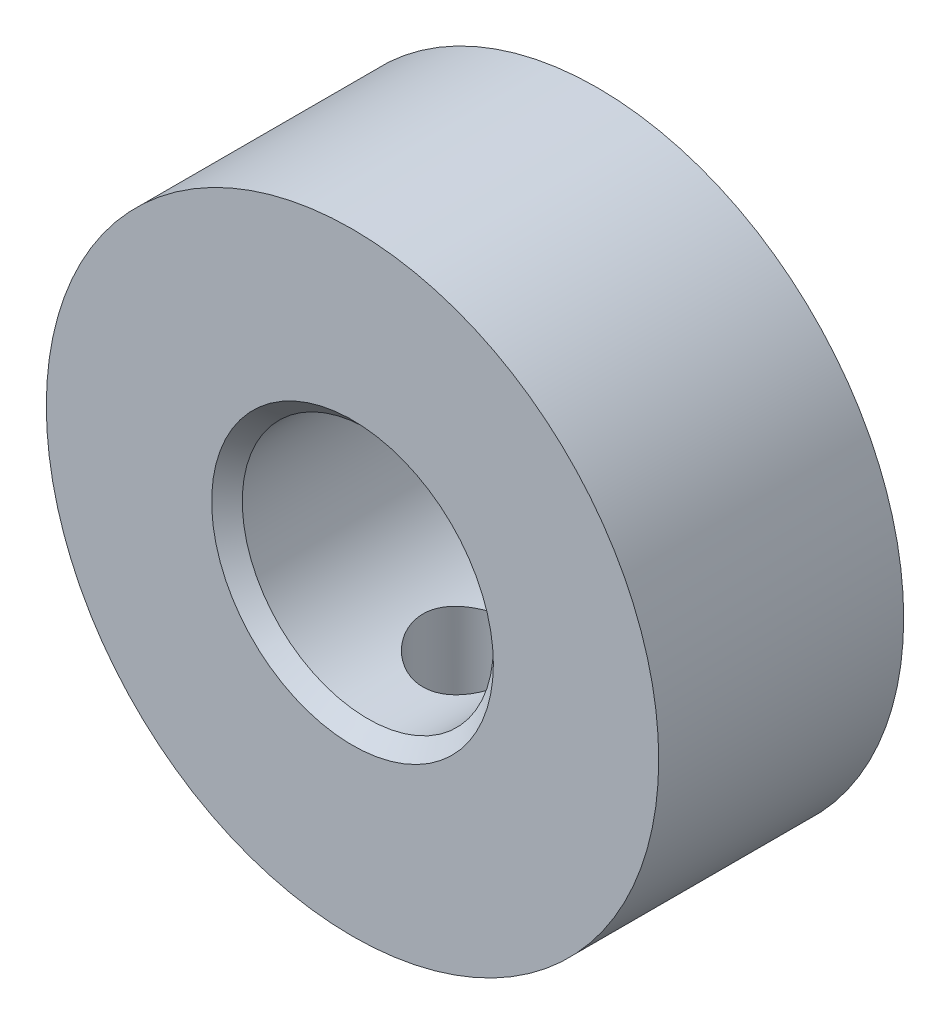
ISO-10303-21;
HEADER;
FILE_DESCRIPTION(('STEP AP214'),'2;1');
FILE_NAME('part.step','',(''),(''),'','','');
FILE_SCHEMA(('AUTOMOTIVE_DESIGN { 1 0 10303 214 1 1 1 1 }'));
ENDSEC;
DATA;
#1=APPLICATION_CONTEXT('core data for automotive mechanical design processes');
#2=APPLICATION_PROTOCOL_DEFINITION('international standard','automotive_design',2000,#1);
#3=PRODUCT_CONTEXT('',#1,'mechanical');
#4=PRODUCT('Part','Part','',(#3));
#5=PRODUCT_RELATED_PRODUCT_CATEGORY('part','',(#4));
#6=PRODUCT_DEFINITION_FORMATION('','',#4);
#7=PRODUCT_DEFINITION_CONTEXT('part definition',#1,'design');
#8=PRODUCT_DEFINITION('design','',#6,#7);
#9=PRODUCT_DEFINITION_SHAPE('','',#8);
#10=(LENGTH_UNIT() NAMED_UNIT(*) SI_UNIT(.MILLI.,.METRE.));
#11=(NAMED_UNIT(*) PLANE_ANGLE_UNIT() SI_UNIT($,.RADIAN.));
#12=(NAMED_UNIT(*) SI_UNIT($,.STERADIAN.) SOLID_ANGLE_UNIT());
#13=UNCERTAINTY_MEASURE_WITH_UNIT(LENGTH_MEASURE(1.E-05),#10,'distance_accuracy_value','');
#14=(GEOMETRIC_REPRESENTATION_CONTEXT(3) GLOBAL_UNCERTAINTY_ASSIGNED_CONTEXT((#13)) GLOBAL_UNIT_ASSIGNED_CONTEXT((#10,
#11,#12)) REPRESENTATION_CONTEXT('',''));
#15=CARTESIAN_POINT('',(0.,0.,0.));
#16=DIRECTION('',(0.,0.,1.));
#17=DIRECTION('',(1.,0.,0.));
#18=AXIS2_PLACEMENT_3D('',#15,#16,#17);
#19=CARTESIAN_POINT('',(0.,0.,8.));
#20=DIRECTION('',(0.,0.,1.));
#21=DIRECTION('',(1.,0.,0.));
#22=AXIS2_PLACEMENT_3D('',#19,#20,#21);
#23=PLANE('',#22);
#24=CARTESIAN_POINT('',(0.,0.,8.));
#25=DIRECTION('',(0.,0.,1.));
#26=DIRECTION('',(1.,0.,0.));
#27=AXIS2_PLACEMENT_3D('',#24,#25,#26);
#28=CIRCLE('',#27,4.6);
#29=CARTESIAN_POINT('',(4.6,0.,8.));
#30=VERTEX_POINT('',#29);
#31=EDGE_CURVE('E10',#30,#30,#28,.F.);
#32=ORIENTED_EDGE('',*,*,#31,.T.);
#33=EDGE_LOOP('',(#32));
#34=FACE_BOUND('',#33,.T.);
#35=CARTESIAN_POINT('',(0.,0.,8.));
#36=DIRECTION('',(0.,0.,1.));
#37=DIRECTION('',(1.,0.,0.));
#38=AXIS2_PLACEMENT_3D('',#35,#36,#37);
#39=CIRCLE('',#38,10.);
#40=CARTESIAN_POINT('',(10.,0.,8.));
#41=VERTEX_POINT('',#40);
#42=EDGE_CURVE('E63',#41,#41,#39,.T.);
#43=ORIENTED_EDGE('',*,*,#42,.T.);
#44=EDGE_LOOP('',(#43));
#45=FACE_BOUND('',#44,.T.);
#46=ADVANCED_FACE('F38',(#34,#45),#23,.T.);
#47=CARTESIAN_POINT('',(0.,0.,0.));
#48=DIRECTION('',(0.,0.,1.));
#49=DIRECTION('',(1.,0.,0.));
#50=AXIS2_PLACEMENT_3D('',#47,#48,#49);
#51=PLANE('',#50);
#52=CARTESIAN_POINT('',(0.,0.,0.));
#53=DIRECTION('',(0.,0.,1.));
#54=DIRECTION('',(1.,0.,0.));
#55=AXIS2_PLACEMENT_3D('',#52,#53,#54);
#56=CIRCLE('',#55,4.6);
#57=CARTESIAN_POINT('',(4.6,0.,0.));
#58=VERTEX_POINT('',#57);
#59=EDGE_CURVE('E57',#58,#58,#56,.T.);
#60=ORIENTED_EDGE('',*,*,#59,.T.);
#61=EDGE_LOOP('',(#60));
#62=FACE_BOUND('',#61,.T.);
#63=CARTESIAN_POINT('',(0.,0.,0.));
#64=DIRECTION('',(0.,0.,1.));
#65=DIRECTION('',(1.,0.,0.));
#66=AXIS2_PLACEMENT_3D('',#63,#64,#65);
#67=CIRCLE('',#66,10.);
#68=CARTESIAN_POINT('',(10.,0.,0.));
#69=VERTEX_POINT('',#68);
#70=EDGE_CURVE('E74',#69,#69,#67,.T.);
#71=ORIENTED_EDGE('',*,*,#70,.F.);
#72=EDGE_LOOP('',(#71));
#73=FACE_BOUND('',#72,.T.);
#74=ADVANCED_FACE('F96',(#62,#73),#51,.F.);
#75=CARTESIAN_POINT('',(0.,0.,8.));
#76=DIRECTION('',(0.,0.,-1.));
#77=DIRECTION('',(-1.,0.,0.));
#78=AXIS2_PLACEMENT_3D('',#75,#76,#77);
#79=CYLINDRICAL_SURFACE('',#78,10.);
#80=CARTESIAN_POINT('',(0.,-10.,5.7));
#81=CARTESIAN_POINT('',(0.0947576878946058,-9.99999835850477,5.69999622573177));
#82=CARTESIAN_POINT('',(0.189566391791717,-9.99863913653262,5.69205057062681));
#83=CARTESIAN_POINT('',(0.376522793597835,-9.99334783512617,5.66049220418699));
#84=CARTESIAN_POINT('',(0.468667995816795,-9.98941341945108,5.63686526636681));
#85=CARTESIAN_POINT('',(0.647565634171713,-9.97941284762061,5.5746799214328));
#86=CARTESIAN_POINT('',(0.734322482783481,-9.97334846350343,5.53613392359734));
#87=CARTESIAN_POINT('',(0.900126684803734,-9.95975405257942,5.44523755915599));
#88=CARTESIAN_POINT('',(0.979174878995802,-9.95222418588187,5.39288870034129));
#89=CARTESIAN_POINT('',(1.12811339489271,-9.93644939291957,5.27531984199758));
#90=CARTESIAN_POINT('',(1.19791607072673,-9.92819870569956,5.20998957217874));
#91=CARTESIAN_POINT('',(1.32562484199451,-9.91195606359551,5.06854971032551));
#92=CARTESIAN_POINT('',(1.38353017137327,-9.90396412539988,4.99243942471233));
#93=CARTESIAN_POINT('',(1.48615381918915,-9.88908804024087,4.83099528840157));
#94=CARTESIAN_POINT('',(1.53078508643947,-9.88221133503736,4.74560535708332));
#95=CARTESIAN_POINT('',(1.60503692511557,-9.87042444664235,4.56840389405748));
#96=CARTESIAN_POINT('',(1.63465855265173,-9.86551412509698,4.47659281467308));
#97=CARTESIAN_POINT('',(1.67777332304485,-9.85827341734443,4.29008568168441));
#98=CARTESIAN_POINT('',(1.69141802151836,-9.85591880382118,4.19542562160489));
#99=CARTESIAN_POINT('',(1.70266159018217,-9.85398286044504,4.00513257351747));
#100=CARTESIAN_POINT('',(1.70026164178552,-9.8544013264024,3.90949965766145));
#101=CARTESIAN_POINT('',(1.67960740432418,-9.85794215005271,3.72105988737552));
#102=CARTESIAN_POINT('',(1.66152368158915,-9.86103541731158,3.62823371139959));
#103=CARTESIAN_POINT('',(1.6102830462488,-9.86953175017028,3.44695239610902));
#104=CARTESIAN_POINT('',(1.57712559765967,-9.87493489790323,3.35849741234699));
#105=CARTESIAN_POINT('',(1.49650673760764,-9.88747346302157,3.18796053662374));
#106=CARTESIAN_POINT('',(1.44897479731416,-9.89461738721263,3.10591263733837));
#107=CARTESIAN_POINT('',(1.34100625557331,-9.90982670315991,2.95089264138615));
#108=CARTESIAN_POINT('',(1.2805685715006,-9.91789217219545,2.87792130693915));
#109=CARTESIAN_POINT('',(1.14757629513502,-9.93416346380999,2.74213878467748));
#110=CARTESIAN_POINT('',(1.07487542689003,-9.94236975461281,2.67947083474103));
#111=CARTESIAN_POINT('',(0.919914402788671,-9.95790194047775,2.5672014449517));
#112=CARTESIAN_POINT('',(0.837654180639253,-9.96522782943365,2.51760009572201));
#113=CARTESIAN_POINT('',(0.665772592595596,-9.97818481552786,2.43285765289918));
#114=CARTESIAN_POINT('',(0.576144697761933,-9.98381438839473,2.39772955429453));
#115=CARTESIAN_POINT('',(0.392144072691743,-9.99273228163516,2.34306550318677));
#116=CARTESIAN_POINT('',(0.297771756388138,-9.9960208058782,2.3235281929469));
#117=CARTESIAN_POINT('',(0.108195402995363,-9.99985857062862,2.3007952782378));
#118=CARTESIAN_POINT('',(0.0130155823423584,-10.0004407604978,2.29740309616311));
#119=CARTESIAN_POINT('',(-0.176552208617397,-9.99889062262385,2.3065321559387));
#120=CARTESIAN_POINT('',(-0.270940210514253,-9.99675840369713,2.31905275986994));
#121=CARTESIAN_POINT('',(-0.45563535434648,-9.99003944415581,2.35948848070541));
#122=CARTESIAN_POINT('',(-0.545964490519937,-9.98546827833647,2.38730594801102));
#123=CARTESIAN_POINT('',(-0.720677070626035,-9.97438190041171,2.45744142252537));
#124=CARTESIAN_POINT('',(-0.805060169222212,-9.96786657550744,2.49976027111592));
#125=CARTESIAN_POINT('',(-0.966336947941809,-9.95353279680435,2.59814514084035));
#126=CARTESIAN_POINT('',(-1.04315493575005,-9.94570295183439,2.65433354824676));
#127=CARTESIAN_POINT('',(-1.18634178293015,-9.92964218696026,2.77869462066718));
#128=CARTESIAN_POINT('',(-1.25270984995668,-9.92141123670496,2.84686819360481));
#129=CARTESIAN_POINT('',(-1.37384438851324,-9.90536897279412,2.99414735608119));
#130=CARTESIAN_POINT('',(-1.42847783237172,-9.89756315078007,3.07336305184613));
#131=CARTESIAN_POINT('',(-1.52366227424996,-9.88335868818869,3.23996306416147));
#132=CARTESIAN_POINT('',(-1.56421373154811,-9.87696000172068,3.32734711418624));
#133=CARTESIAN_POINT('',(-1.62988570006916,-9.86633579141612,3.50743659824515));
#134=CARTESIAN_POINT('',(-1.65507162400974,-9.86210106805335,3.60011761130745));
#135=CARTESIAN_POINT('',(-1.68950285881336,-9.85626147937876,3.78847292754593));
#136=CARTESIAN_POINT('',(-1.69874961719307,-9.85465637525851,3.88414695810744));
#137=CARTESIAN_POINT('',(-1.70099842807247,-9.85426833565764,4.07444350772364));
#138=CARTESIAN_POINT('',(-1.69420993359398,-9.85544901199148,4.16906354235195));
#139=CARTESIAN_POINT('',(-1.66503470775952,-9.86041960844602,4.35579399978883));
#140=CARTESIAN_POINT('',(-1.64264803293704,-9.86420951910991,4.44790443169185));
#141=CARTESIAN_POINT('',(-1.5829934295977,-9.87395749749249,4.62691516544886));
#142=CARTESIAN_POINT('',(-1.54574424734569,-9.87991283309771,4.71382187261607));
#143=CARTESIAN_POINT('',(-1.45744370457911,-9.893323172577,4.88018632233269));
#144=CARTESIAN_POINT('',(-1.40639161431834,-9.90077825573591,4.9596436707426));
#145=CARTESIAN_POINT('',(-1.29118985102456,-9.91646308896848,5.10991077053724));
#146=CARTESIAN_POINT('',(-1.22688632923809,-9.92470126313324,5.18060171244106));
#147=CARTESIAN_POINT('',(-1.08733098491411,-9.94095750314496,5.31026123501716));
#148=CARTESIAN_POINT('',(-1.01207664192477,-9.94897551781341,5.36922710962256));
#149=CARTESIAN_POINT('',(-0.852109586538185,-9.96395520458386,5.47415295786146));
#150=CARTESIAN_POINT('',(-0.767332551982331,-9.9709088381394,5.52001602854875));
#151=CARTESIAN_POINT('',(-0.591192591150801,-9.98289805427614,5.59677871335402));
#152=CARTESIAN_POINT('',(-0.499836270638975,-9.98793552965723,5.62769310215958));
#153=CARTESIAN_POINT('',(-0.34011457314761,-9.99443647001914,5.66703632248238));
#154=CARTESIAN_POINT('',(-0.272710808068804,-9.99651154722548,5.67937770544731));
#155=CARTESIAN_POINT('',(-0.136880224020147,-9.99929389258055,5.69586083226231));
#156=CARTESIAN_POINT('',(-0.0684534238433404,-10.0000011858243,5.70000272655009));
#157=CARTESIAN_POINT('',(0.,-10.,5.7));
#158=B_SPLINE_CURVE_WITH_KNOTS('',3,(#80,#81,#82,#83,#84,#85,#86,#87,#88,#89,#90,#91,#92,#93,
#94,#95,#96,#97,#98,#99,#100,#101,#102,#103,#104,#105,#106,#107,#108,#109,#110,#111,#112,#113,
#114,#115,#116,#117,#118,#119,#120,#121,#122,#123,#124,#125,#126,#127,#128,#129,#130,#131,#132,
#133,#134,#135,#136,#137,#138,#139,#140,#141,#142,#143,#144,#145,#146,#147,#148,#149,#150,#151,
#152,#153,#154,#155,#156,#157),.UNSPECIFIED.,.T.,.F.,(4,2,2,2,2,2,2,2,2,2,2,2,2,2,2,2,2,2,2,2,2,
2,2,2,2,2,2,2,2,2,2,2,2,2,2,2,2,2,4),(0.,0.284022828438539,0.568303682958859,0.852348586605788,
1.13636247471906,1.42290084405775,1.70945765745934,1.99785424638948,2.28623054029933,
2.57184857573334,2.85744558052973,3.1399750242267,3.42251451474645,3.70646342600059,
3.99043616626788,4.27807283462104,4.56571149782112,4.85360786111796,5.14147914998386,
5.42583629106419,5.71018203306509,5.99273333952095,6.27530104260756,6.56045734817343,
6.84563526477151,7.13389286809599,7.42214106913036,7.70915344460832,7.99613975365977,
8.2793982075421,8.56265563479788,8.84555690967838,9.12847314419732,9.41488053086677,
9.70135394191367,9.98989417240834,10.2781486352408,10.4833319001627,10.6885114005101),.UNSPECIFIED.);
#159=CARTESIAN_POINT('',(0.,-10.,5.7));
#160=VERTEX_POINT('',#159);
#161=EDGE_CURVE('E73',#160,#160,#158,.T.);
#162=ORIENTED_EDGE('',*,*,#161,.T.);
#163=EDGE_LOOP('',(#162));
#164=FACE_BOUND('',#163,.T.);
#165=ORIENTED_EDGE('',*,*,#42,.F.);
#166=EDGE_LOOP('',(#165));
#167=FACE_BOUND('',#166,.T.);
#168=ORIENTED_EDGE('',*,*,#70,.T.);
#169=EDGE_LOOP('',(#168));
#170=FACE_BOUND('',#169,.T.);
#171=ADVANCED_FACE('F92',(#164,#167,#170),#79,.T.);
#172=CARTESIAN_POINT('',(0.,0.,8.));
#173=DIRECTION('',(0.,0.,-1.));
#174=DIRECTION('',(-1.,0.,0.));
#175=AXIS2_PLACEMENT_3D('',#172,#173,#174);
#176=CYLINDRICAL_SURFACE('',#175,4.1);
#177=CARTESIAN_POINT('',(0.,0.,0.500000000000004));
#178=DIRECTION('',(0.,0.,1.));
#179=DIRECTION('',(1.,0.,0.));
#180=AXIS2_PLACEMENT_3D('',#177,#178,#179);
#181=CIRCLE('',#180,4.1);
#182=CARTESIAN_POINT('',(4.1,0.,0.500000000000004));
#183=VERTEX_POINT('',#182);
#184=EDGE_CURVE('E47',#183,#183,#181,.F.);
#185=ORIENTED_EDGE('',*,*,#184,.T.);
#186=EDGE_LOOP('',(#185));
#187=FACE_BOUND('',#186,.T.);
#188=CARTESIAN_POINT('',(0.,0.,7.5));
#189=DIRECTION('',(0.,0.,1.));
#190=DIRECTION('',(1.,0.,0.));
#191=AXIS2_PLACEMENT_3D('',#188,#189,#190);
#192=CIRCLE('',#191,4.1);
#193=CARTESIAN_POINT('',(4.1,0.,7.5));
#194=VERTEX_POINT('',#193);
#195=EDGE_CURVE('E52',#194,#194,#192,.T.);
#196=ORIENTED_EDGE('',*,*,#195,.T.);
#197=EDGE_LOOP('',(#196));
#198=FACE_BOUND('',#197,.T.);
#199=CARTESIAN_POINT('',(0.,-4.1,5.7));
#200=CARTESIAN_POINT('',(0.0911007358921382,-4.09999275498596,5.69999034395095));
#201=CARTESIAN_POINT('',(0.182346649212687,-4.09692840504109,5.69263357839729));
#202=CARTESIAN_POINT('',(0.362254112828896,-4.08496686720582,5.66346686598952));
#203=CARTESIAN_POINT('',(0.450908244612507,-4.0760543781851,5.64161900285397));
#204=CARTESIAN_POINT('',(0.622735337859244,-4.05335455224852,5.58441409986118));
#205=CARTESIAN_POINT('',(0.705925693741691,-4.03958367378215,5.54910263755709));
#206=CARTESIAN_POINT('',(0.865121939414908,-4.00850984756347,5.46616009230658));
#207=CARTESIAN_POINT('',(0.941130034595615,-3.99120798922624,5.41853280795962));
#208=CARTESIAN_POINT('',(1.08771109690362,-3.95384173760217,5.30980370132536));
#209=CARTESIAN_POINT('',(1.15787920713156,-3.9336874486463,5.24818723789168));
#210=CARTESIAN_POINT('',(1.28723328243853,-3.89328035010803,5.11431671327959));
#211=CARTESIAN_POINT('',(1.34641351705595,-3.87302749473921,5.04205713647242));
#212=CARTESIAN_POINT('',(1.45495341584358,-3.83361583343055,4.88469230882571));
#213=CARTESIAN_POINT('',(1.5036958192804,-3.81455807399511,4.79913335782831));
#214=CARTESIAN_POINT('',(1.5859163946212,-3.78111808784606,4.62012573756447));
#215=CARTESIAN_POINT('',(1.61940235433293,-3.76673347675458,4.52668112255434));
#216=CARTESIAN_POINT('',(1.66849189218159,-3.74524045404294,4.33921392980458));
#217=CARTESIAN_POINT('',(1.68487418822338,-3.7378169256971,4.24543277640294));
#218=CARTESIAN_POINT('',(1.70172127906192,-3.73017953459879,4.05618146857223));
#219=CARTESIAN_POINT('',(1.70219473045057,-3.7299617509346,3.96071226097421));
#220=CARTESIAN_POINT('',(1.68779767215707,-3.73649350097125,3.77851645299604));
#221=CARTESIAN_POINT('',(1.67408709299964,-3.74271635467768,3.69167553662301));
#222=CARTESIAN_POINT('',(1.63365536061752,-3.7605389308353,3.52166070946235));
#223=CARTESIAN_POINT('',(1.60693174407494,-3.77213967127978,3.43848749620895));
#224=CARTESIAN_POINT('',(1.54071283954858,-3.79967211880887,3.27607984337833));
#225=CARTESIAN_POINT('',(1.50095904419065,-3.81569034892087,3.19696613237559));
#226=CARTESIAN_POINT('',(1.40999084808006,-3.85023234318601,3.0462268976559));
#227=CARTESIAN_POINT('',(1.35877195283524,-3.86875708880153,2.97460432677887));
#228=CARTESIAN_POINT('',(1.24129926350693,-3.90810945018053,2.8345777798229));
#229=CARTESIAN_POINT('',(1.17414644562624,-3.92900010820888,2.76694361712882));
#230=CARTESIAN_POINT('',(1.02924251739151,-3.96942233403467,2.64364002425494));
#231=CARTESIAN_POINT('',(0.951488978795617,-3.98895358888914,2.58797334294271));
#232=CARTESIAN_POINT('',(0.78527076860891,-4.02501351327951,2.48907096369056));
#233=CARTESIAN_POINT('',(0.696603343386468,-4.04146413493322,2.44614546021915));
#234=CARTESIAN_POINT('',(0.512449664245528,-4.06891137118428,2.37608946997357));
#235=CARTESIAN_POINT('',(0.416967173258345,-4.07991096931192,2.34895034136363));
#236=CARTESIAN_POINT('',(0.228329442107725,-4.09466114632034,2.31284195589147));
#237=CARTESIAN_POINT('',(0.135404122173082,-4.09882328161734,2.30283942155831));
#238=CARTESIAN_POINT('',(-0.0508826497416922,-4.10074110471982,2.29821131078214));
#239=CARTESIAN_POINT('',(-0.144243970553282,-4.09849860915873,2.30358137399912));
#240=CARTESIAN_POINT('',(-0.323933229870337,-4.08812640970295,2.32880371863556));
#241=CARTESIAN_POINT('',(-0.410381562191926,-4.08029079773794,2.34793290156062));
#242=CARTESIAN_POINT('',(-0.57874939179889,-4.05983327735539,2.39912689660059));
#243=CARTESIAN_POINT('',(-0.660668314097214,-4.04721076285444,2.43119334677271));
#244=CARTESIAN_POINT('',(-0.820519085063912,-4.01790488185238,2.5083995894877));
#245=CARTESIAN_POINT('',(-0.898248421541317,-4.00110769091576,2.55391407060684));
#246=CARTESIAN_POINT('',(-1.04524395127934,-3.9652489044558,2.65631221051198));
#247=CARTESIAN_POINT('',(-1.11450660721144,-3.94618636900006,2.71320059526381));
#248=CARTESIAN_POINT('',(-1.24775563268976,-3.90618524654881,2.84144527388076));
#249=CARTESIAN_POINT('',(-1.31102126761269,-3.8852093879018,2.91354072825089));
#250=CARTESIAN_POINT('',(-1.42475420928496,-3.84496089148168,3.06766444796893));
#251=CARTESIAN_POINT('',(-1.47521871397738,-3.82568862721113,3.14969488220253));
#252=CARTESIAN_POINT('',(-1.56243201596209,-3.79091683252683,3.32299388732462));
#253=CARTESIAN_POINT('',(-1.5989842044026,-3.77547238701943,3.41437326852956));
#254=CARTESIAN_POINT('',(-1.6558755082131,-3.75087388596625,3.60283057817902));
#255=CARTESIAN_POINT('',(-1.67622781672216,-3.7417147125516,3.69990380024874));
#256=CARTESIAN_POINT('',(-1.69883661999131,-3.73150021658643,3.88900430566553));
#257=CARTESIAN_POINT('',(-1.70235647625963,-3.72987938397837,3.98085072324893));
#258=CARTESIAN_POINT('',(-1.6945663973736,-3.73342517837402,4.16376944022428));
#259=CARTESIAN_POINT('',(-1.6832586861495,-3.73859078750547,4.25484185364429));
#260=CARTESIAN_POINT('',(-1.64719217832742,-3.75461273873087,4.42934637188749));
#261=CARTESIAN_POINT('',(-1.62307103822133,-3.76519851284066,4.51293746661434));
#262=CARTESIAN_POINT('',(-1.56268239413881,-3.79065849130231,4.67490725006448));
#263=CARTESIAN_POINT('',(-1.52641148404645,-3.80553389806435,4.75328446971533));
#264=CARTESIAN_POINT('',(-1.44025413354863,-3.83900019576287,4.90771571381545));
#265=CARTESIAN_POINT('',(-1.38968323542902,-3.85776006825823,4.98335058756635));
#266=CARTESIAN_POINT('',(-1.27732507989816,-3.89640440277369,5.12545633807425));
#267=CARTESIAN_POINT('',(-1.21553399450351,-3.91628924700071,5.19192407362562));
#268=CARTESIAN_POINT('',(-1.07721838539403,-3.95665876255694,5.31871893703666));
#269=CARTESIAN_POINT('',(-0.999954396767512,-3.97708393182535,5.37826210536611));
#270=CARTESIAN_POINT('',(-0.835771439971993,-4.01479386030464,5.48357483044141));
#271=CARTESIAN_POINT('',(-0.748848089297281,-4.03207718459242,5.52933809995295));
#272=CARTESIAN_POINT('',(-0.569196959269502,-4.06130032550488,5.60479013765762));
#273=CARTESIAN_POINT('',(-0.476591439211843,-4.07332515050765,5.63473639376195));
#274=CARTESIAN_POINT('',(-0.287223885073883,-4.09102335614945,5.67835679042498));
#275=CARTESIAN_POINT('',(-0.19047588504684,-4.09671665385337,5.69208196617716));
#276=CARTESIAN_POINT('',(-0.0622723279160415,-4.09964765337739,5.69914790593771));
#277=CARTESIAN_POINT('',(-0.0311446477923906,-4.10000247685607,5.70000330111765));
#278=CARTESIAN_POINT('',(0.,-4.1,5.7));
#279=B_SPLINE_CURVE_WITH_KNOTS('',3,(#199,#200,#201,#202,#203,#204,#205,#206,#207,#208,#209,
#210,#211,#212,#213,#214,#215,#216,#217,#218,#219,#220,#221,#222,#223,#224,#225,#226,#227,#228,
#229,#230,#231,#232,#233,#234,#235,#236,#237,#238,#239,#240,#241,#242,#243,#244,#245,#246,#247,
#248,#249,#250,#251,#252,#253,#254,#255,#256,#257,#258,#259,#260,#261,#262,#263,#264,#265,#266,
#267,#268,#269,#270,#271,#272,#273,#274,#275,#276,#277,#278),.UNSPECIFIED.,.T.,.F.,(4,2,2,2,2,2,
2,2,2,2,2,2,2,2,2,2,2,2,2,2,2,2,2,2,2,2,2,2,2,2,2,2,2,2,2,2,2,2,2,4),(0.,0.273214216469308,
0.547146139090984,0.820158852710682,1.09308746057343,1.37843880104633,1.66393854416016,
1.96331723505256,2.26254293333751,2.5474564682915,2.83221496872123,3.09539663285742,
3.35862813564771,3.62743468682299,3.89634679934188,4.18774300099234,4.47920606347556,
4.77727221521278,5.07517504454113,5.35438487420058,5.63351551560667,5.89895803795337,
6.16443417996288,6.4381456105688,6.71197100813975,7.00518296769783,7.2984590535476,
7.59573810095962,7.89277479668891,8.16712508466142,8.44143422858779,8.70322021216304,
8.96507964739238,9.24259701314171,9.52020923779753,9.81776121871276,10.1154487560781,
10.4081279234338,10.6998837834692,10.7932876452545),.UNSPECIFIED.);
#280=CARTESIAN_POINT('',(0.,-4.1,5.7));
#281=VERTEX_POINT('',#280);
#282=EDGE_CURVE('E64',#281,#281,#279,.T.);
#283=ORIENTED_EDGE('',*,*,#282,.F.);
#284=EDGE_LOOP('',(#283));
#285=FACE_BOUND('',#284,.T.);
#286=ADVANCED_FACE('F76',(#187,#198,#285),#176,.F.);
#287=CARTESIAN_POINT('',(0.,-15.,4.));
#288=DIRECTION('',(0.,1.,0.));
#289=DIRECTION('',(0.,0.,1.));
#290=AXIS2_PLACEMENT_3D('',#287,#288,#289);
#291=CYLINDRICAL_SURFACE('',#290,1.7);
#292=ORIENTED_EDGE('',*,*,#282,.T.);
#293=EDGE_LOOP('',(#292));
#294=FACE_BOUND('',#293,.T.);
#295=ORIENTED_EDGE('',*,*,#161,.F.);
#296=EDGE_LOOP('',(#295));
#297=FACE_BOUND('',#296,.T.);
#298=ADVANCED_FACE('F79',(#294,#297),#291,.F.);
#299=CARTESIAN_POINT('',(0.,0.,0.));
#300=DIRECTION('',(0.,0.,-1.));
#301=DIRECTION('',(-1.,0.,0.));
#302=AXIS2_PLACEMENT_3D('',#299,#300,#301);
#303=CONICAL_SURFACE('',#302,4.6,0.785398163397445);
#304=ORIENTED_EDGE('',*,*,#184,.F.);
#305=EDGE_LOOP('',(#304));
#306=FACE_BOUND('',#305,.T.);
#307=ORIENTED_EDGE('',*,*,#59,.F.);
#308=EDGE_LOOP('',(#307));
#309=FACE_BOUND('',#308,.T.);
#310=ADVANCED_FACE('F82',(#306,#309),#303,.F.);
#311=CARTESIAN_POINT('',(0.,0.,7.5));
#312=DIRECTION('',(0.,0.,1.));
#313=DIRECTION('',(1.,0.,0.));
#314=AXIS2_PLACEMENT_3D('',#311,#312,#313);
#315=CONICAL_SURFACE('',#314,4.1,0.785398163397448);
#316=ORIENTED_EDGE('',*,*,#31,.F.);
#317=EDGE_LOOP('',(#316));
#318=FACE_BOUND('',#317,.T.);
#319=ORIENTED_EDGE('',*,*,#195,.F.);
#320=EDGE_LOOP('',(#319));
#321=FACE_BOUND('',#320,.T.);
#322=ADVANCED_FACE('F41',(#318,#321),#315,.F.);
#323=CLOSED_SHELL('',(#46,#74,#171,#286,#298,#310,#322));
#324=MANIFOLD_SOLID_BREP('B2',#323);
#325=ADVANCED_BREP_SHAPE_REPRESENTATION('',(#18,#324),#14);
#326=SHAPE_DEFINITION_REPRESENTATION(#9,#325);
ENDSEC;
END-ISO-10303-21;
